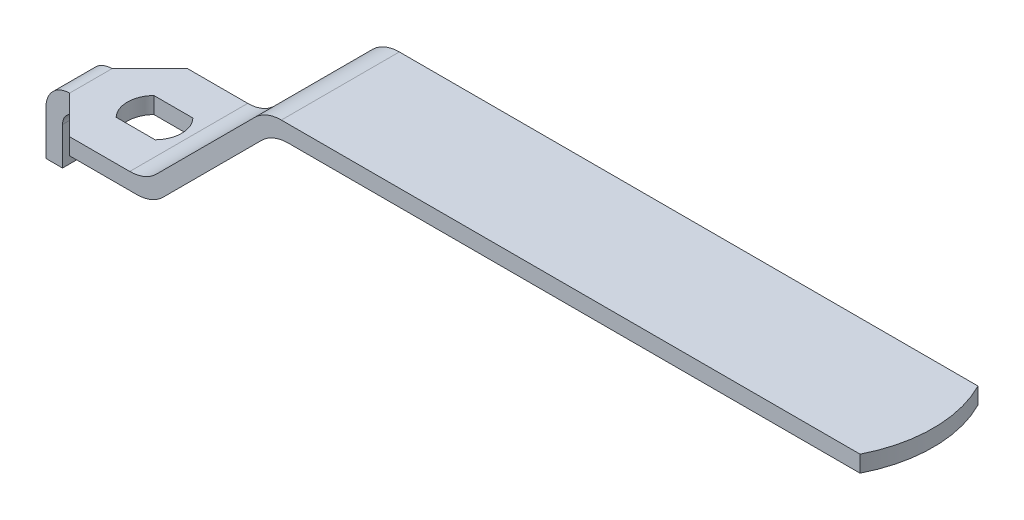
ISO-10303-21;
HEADER;
FILE_DESCRIPTION(('STEP AP214'),'2;1');
FILE_NAME('part.step','',(''),(''),'','','');
FILE_SCHEMA(('AUTOMOTIVE_DESIGN { 1 0 10303 214 1 1 1 1 }'));
ENDSEC;
DATA;
#1=APPLICATION_CONTEXT('core data for automotive mechanical design processes');
#2=APPLICATION_PROTOCOL_DEFINITION('international standard','automotive_design',2000,#1);
#3=PRODUCT_CONTEXT('',#1,'mechanical');
#4=PRODUCT('Part','Part','',(#3));
#5=PRODUCT_RELATED_PRODUCT_CATEGORY('part','',(#4));
#6=PRODUCT_DEFINITION_FORMATION('','',#4);
#7=PRODUCT_DEFINITION_CONTEXT('part definition',#1,'design');
#8=PRODUCT_DEFINITION('design','',#6,#7);
#9=PRODUCT_DEFINITION_SHAPE('','',#8);
#10=(LENGTH_UNIT() NAMED_UNIT(*) SI_UNIT(.MILLI.,.METRE.));
#11=(NAMED_UNIT(*) PLANE_ANGLE_UNIT() SI_UNIT($,.RADIAN.));
#12=(NAMED_UNIT(*) SI_UNIT($,.STERADIAN.) SOLID_ANGLE_UNIT());
#13=UNCERTAINTY_MEASURE_WITH_UNIT(LENGTH_MEASURE(1.E-05),#10,'distance_accuracy_value','');
#14=(GEOMETRIC_REPRESENTATION_CONTEXT(3) GLOBAL_UNCERTAINTY_ASSIGNED_CONTEXT((#13)) GLOBAL_UNIT_ASSIGNED_CONTEXT((#10,
#11,#12)) REPRESENTATION_CONTEXT('',''));
#15=CARTESIAN_POINT('',(0.,0.,0.));
#16=DIRECTION('',(0.,0.,1.));
#17=DIRECTION('',(1.,0.,0.));
#18=AXIS2_PLACEMENT_3D('',#15,#16,#17);
#19=CARTESIAN_POINT('',(-18.5,-14.5,12.5));
#20=DIRECTION('',(0.,1.,0.));
#21=DIRECTION('',(0.,0.,1.));
#22=AXIS2_PLACEMENT_3D('',#19,#20,#21);
#23=PLANE('',#22);
#24=DIRECTION('',(-1.,0.,0.));
#25=VECTOR('',#24,1.);
#26=CARTESIAN_POINT('',(-13.5,-14.5,4.5));
#27=LINE('',#26,#25);
#28=CARTESIAN_POINT('',(-15.,-14.5,4.5));
#29=VERTEX_POINT('',#28);
#30=CARTESIAN_POINT('',(-18.5,-14.5,4.5));
#31=VERTEX_POINT('',#30);
#32=EDGE_CURVE('E222',#29,#31,#27,.T.);
#33=ORIENTED_EDGE('',*,*,#32,.T.);
#34=DIRECTION('',(0.,0.,-1.));
#35=VECTOR('',#34,1.);
#36=CARTESIAN_POINT('',(-18.5,-14.5,12.5));
#37=LINE('',#36,#35);
#38=CARTESIAN_POINT('',(-18.5,-14.5,-4.5));
#39=VERTEX_POINT('',#38);
#40=EDGE_CURVE('E217',#31,#39,#37,.T.);
#41=ORIENTED_EDGE('',*,*,#40,.T.);
#42=DIRECTION('',(1.,0.,0.));
#43=VECTOR('',#42,1.);
#44=CARTESIAN_POINT('',(-13.5,-14.5,-4.5));
#45=LINE('',#44,#43);
#46=CARTESIAN_POINT('',(-15.,-14.5,-4.5));
#47=VERTEX_POINT('',#46);
#48=EDGE_CURVE('E205',#39,#47,#45,.T.);
#49=ORIENTED_EDGE('',*,*,#48,.T.);
#50=DIRECTION('',(0.,0.,1.));
#51=VECTOR('',#50,1.);
#52=CARTESIAN_POINT('',(-15.,-14.5,12.5));
#53=LINE('',#52,#51);
#54=EDGE_CURVE('E209',#47,#29,#53,.T.);
#55=ORIENTED_EDGE('',*,*,#54,.T.);
#56=EDGE_LOOP('',(#33,#41,#49,#55));
#57=FACE_BOUND('',#56,.T.);
#58=ADVANCED_FACE('F17',(#57),#23,.F.);
#59=CARTESIAN_POINT('',(-18.5,-14.5,12.5));
#60=DIRECTION('',(1.,0.,0.));
#61=DIRECTION('',(0.,0.,-1.));
#62=AXIS2_PLACEMENT_3D('',#59,#60,#61);
#63=PLANE('',#62);
#64=DIRECTION('',(0.,1.,0.));
#65=VECTOR('',#64,1.);
#66=CARTESIAN_POINT('',(-18.5,-50.,4.5));
#67=LINE('',#66,#65);
#68=CARTESIAN_POINT('',(-18.5,-5.,4.5));
#69=VERTEX_POINT('',#68);
#70=EDGE_CURVE('E225',#31,#69,#67,.T.);
#71=ORIENTED_EDGE('',*,*,#70,.T.);
#72=DIRECTION('',(0.,0.,1.));
#73=VECTOR('',#72,1.);
#74=CARTESIAN_POINT('',(-18.5,-5.,12.5));
#75=LINE('',#74,#73);
#76=CARTESIAN_POINT('',(-18.5,-5.,-4.5));
#77=VERTEX_POINT('',#76);
#78=EDGE_CURVE('E187',#77,#69,#75,.T.);
#79=ORIENTED_EDGE('',*,*,#78,.F.);
#80=DIRECTION('',(0.,1.,0.));
#81=VECTOR('',#80,1.);
#82=CARTESIAN_POINT('',(-18.5,-50.,-4.5));
#83=LINE('',#82,#81);
#84=EDGE_CURVE('E183',#77,#39,#83,.F.);
#85=ORIENTED_EDGE('',*,*,#84,.T.);
#86=ORIENTED_EDGE('',*,*,#40,.F.);
#87=EDGE_LOOP('',(#71,#79,#85,#86));
#88=FACE_BOUND('',#87,.T.);
#89=ADVANCED_FACE('F440',(#88),#63,.F.);
#90=CARTESIAN_POINT('',(-15.,-14.5,12.5));
#91=DIRECTION('',(-1.,0.,0.));
#92=DIRECTION('',(0.,0.,1.));
#93=AXIS2_PLACEMENT_3D('',#90,#91,#92);
#94=PLANE('',#93);
#95=DIRECTION('',(0.,1.,0.));
#96=VECTOR('',#95,1.);
#97=CARTESIAN_POINT('',(-15.,-50.,4.5));
#98=LINE('',#97,#96);
#99=CARTESIAN_POINT('',(-15.,-6.5,4.5));
#100=VERTEX_POINT('',#99);
#101=EDGE_CURVE('E226',#100,#29,#98,.F.);
#102=ORIENTED_EDGE('',*,*,#101,.T.);
#103=ORIENTED_EDGE('',*,*,#54,.F.);
#104=DIRECTION('',(0.,1.,0.));
#105=VECTOR('',#104,1.);
#106=CARTESIAN_POINT('',(-15.,-50.,-4.5));
#107=LINE('',#106,#105);
#108=CARTESIAN_POINT('',(-15.,-6.5,-4.5));
#109=VERTEX_POINT('',#108);
#110=EDGE_CURVE('E203',#47,#109,#107,.T.);
#111=ORIENTED_EDGE('',*,*,#110,.T.);
#112=DIRECTION('',(0.,0.,1.));
#113=VECTOR('',#112,1.);
#114=CARTESIAN_POINT('',(-15.,-6.5,12.5));
#115=LINE('',#114,#113);
#116=EDGE_CURVE('E212',#109,#100,#115,.T.);
#117=ORIENTED_EDGE('',*,*,#116,.T.);
#118=EDGE_LOOP('',(#102,#103,#111,#117));
#119=FACE_BOUND('',#118,.T.);
#120=ADVANCED_FACE('F446',(#119),#94,.F.);
#121=CARTESIAN_POINT('',(-13.5,-50.,-4.5));
#122=DIRECTION('',(0.,0.,1.));
#123=DIRECTION('',(1.,0.,0.));
#124=AXIS2_PLACEMENT_3D('',#121,#122,#123);
#125=PLANE('',#124);
#126=CARTESIAN_POINT('',(-12.,-6.5,-4.5));
#127=DIRECTION('',(0.,0.,1.));
#128=DIRECTION('',(1.,0.,0.));
#129=AXIS2_PLACEMENT_3D('',#126,#127,#128);
#130=CIRCLE('',#129,3.);
#131=CARTESIAN_POINT('',(-13.5,-3.9019237886467,-4.50000000000001));
#132=VERTEX_POINT('',#131);
#133=EDGE_CURVE('E216',#132,#109,#130,.T.);
#134=ORIENTED_EDGE('',*,*,#133,.T.);
#135=ORIENTED_EDGE('',*,*,#110,.F.);
#136=ORIENTED_EDGE('',*,*,#48,.F.);
#137=ORIENTED_EDGE('',*,*,#84,.F.);
#138=CARTESIAN_POINT('',(-13.5,-5.,-4.5));
#139=DIRECTION('',(0.,0.,1.));
#140=DIRECTION('',(1.,0.,0.));
#141=AXIS2_PLACEMENT_3D('',#138,#139,#140);
#142=CIRCLE('',#141,5.);
#143=CARTESIAN_POINT('',(-13.5,0.,-4.50000000000001));
#144=VERTEX_POINT('',#143);
#145=EDGE_CURVE('E20',#144,#77,#142,.T.);
#146=ORIENTED_EDGE('',*,*,#145,.F.);
#147=DIRECTION('',(0.,1.,0.));
#148=VECTOR('',#147,1.);
#149=CARTESIAN_POINT('',(-13.5,-50.,-4.50000000000002));
#150=LINE('',#149,#148);
#151=EDGE_CURVE('E153',#144,#132,#150,.F.);
#152=ORIENTED_EDGE('',*,*,#151,.T.);
#153=EDGE_LOOP('',(#134,#135,#136,#137,#146,#152));
#154=FACE_BOUND('',#153,.T.);
#155=ADVANCED_FACE('F180',(#154),#125,.F.);
#156=CARTESIAN_POINT('',(-13.5,-5.,12.5));
#157=DIRECTION('',(0.,0.,1.));
#158=DIRECTION('',(1.,0.,0.));
#159=AXIS2_PLACEMENT_3D('',#156,#157,#158);
#160=CYLINDRICAL_SURFACE('',#159,5.);
#161=DIRECTION('',(0.,0.,1.));
#162=VECTOR('',#161,1.);
#163=CARTESIAN_POINT('',(-13.5,0.,12.5));
#164=LINE('',#163,#162);
#165=CARTESIAN_POINT('',(-13.5,0.,4.50000000000002));
#166=VERTEX_POINT('',#165);
#167=EDGE_CURVE('E171',#166,#144,#164,.F.);
#168=ORIENTED_EDGE('',*,*,#167,.T.);
#169=ORIENTED_EDGE('',*,*,#145,.T.);
#170=ORIENTED_EDGE('',*,*,#78,.T.);
#171=CARTESIAN_POINT('',(-13.5,-5.,4.5));
#172=DIRECTION('',(0.,0.,1.));
#173=DIRECTION('',(1.,0.,0.));
#174=AXIS2_PLACEMENT_3D('',#171,#172,#173);
#175=CIRCLE('',#174,5.);
#176=EDGE_CURVE('E186',#69,#166,#175,.F.);
#177=ORIENTED_EDGE('',*,*,#176,.T.);
#178=EDGE_LOOP('',(#168,#169,#170,#177));
#179=FACE_BOUND('',#178,.T.);
#180=ADVANCED_FACE('F189',(#179),#160,.T.);
#181=CARTESIAN_POINT('',(-13.5,-50.,4.5));
#182=DIRECTION('',(0.,0.,-1.));
#183=DIRECTION('',(-1.,0.,0.));
#184=AXIS2_PLACEMENT_3D('',#181,#182,#183);
#185=PLANE('',#184);
#186=ORIENTED_EDGE('',*,*,#32,.F.);
#187=ORIENTED_EDGE('',*,*,#101,.F.);
#188=CARTESIAN_POINT('',(-12.,-6.5,4.5));
#189=DIRECTION('',(0.,0.,1.));
#190=DIRECTION('',(1.,0.,0.));
#191=AXIS2_PLACEMENT_3D('',#188,#189,#190);
#192=CIRCLE('',#191,3.);
#193=CARTESIAN_POINT('',(-13.5,-3.9019237886467,4.50000000000001));
#194=VERTEX_POINT('',#193);
#195=EDGE_CURVE('E215',#100,#194,#192,.F.);
#196=ORIENTED_EDGE('',*,*,#195,.T.);
#197=DIRECTION('',(0.,1.,0.));
#198=VECTOR('',#197,1.);
#199=CARTESIAN_POINT('',(-13.5,-50.,4.50000000000002));
#200=LINE('',#199,#198);
#201=EDGE_CURVE('E288',#194,#166,#200,.T.);
#202=ORIENTED_EDGE('',*,*,#201,.T.);
#203=ORIENTED_EDGE('',*,*,#176,.F.);
#204=ORIENTED_EDGE('',*,*,#70,.F.);
#205=EDGE_LOOP('',(#186,#187,#196,#202,#203,#204));
#206=FACE_BOUND('',#205,.T.);
#207=ADVANCED_FACE('F444',(#206),#185,.F.);
#208=CARTESIAN_POINT('',(-12.,-6.5,12.5));
#209=DIRECTION('',(0.,0.,1.));
#210=DIRECTION('',(1.,0.,0.));
#211=AXIS2_PLACEMENT_3D('',#208,#209,#210);
#212=CYLINDRICAL_SURFACE('',#211,3.);
#213=ORIENTED_EDGE('',*,*,#195,.F.);
#214=ORIENTED_EDGE('',*,*,#116,.F.);
#215=ORIENTED_EDGE('',*,*,#133,.F.);
#216=CARTESIAN_POINT('',(-12.,-6.5,-6.00000000000004));
#217=DIRECTION('',(0.707106781186547,0.,0.707106781186548));
#218=DIRECTION('',(-0.707106781186548,0.,0.707106781186547));
#219=AXIS2_PLACEMENT_3D('',#216,#217,#218);
#220=ELLIPSE('',#219,4.24264068711928,3.);
#221=CARTESIAN_POINT('',(-12.,-3.5,-6.00000000000002));
#222=VERTEX_POINT('',#221);
#223=EDGE_CURVE('E160',#132,#222,#220,.F.);
#224=ORIENTED_EDGE('',*,*,#223,.T.);
#225=DIRECTION('',(0.,0.,1.));
#226=VECTOR('',#225,1.);
#227=CARTESIAN_POINT('',(-12.,-3.5,12.5));
#228=LINE('',#227,#226);
#229=CARTESIAN_POINT('',(-12.,-3.5,6.00000000000002));
#230=VERTEX_POINT('',#229);
#231=EDGE_CURVE('E305',#222,#230,#228,.T.);
#232=ORIENTED_EDGE('',*,*,#231,.T.);
#233=CARTESIAN_POINT('',(-12.,-6.5,6.00000000000004));
#234=DIRECTION('',(0.707106781186547,0.,-0.707106781186548));
#235=DIRECTION('',(0.707106781186548,0.,0.707106781186547));
#236=AXIS2_PLACEMENT_3D('',#233,#234,#235);
#237=ELLIPSE('',#236,4.24264068711928,3.);
#238=EDGE_CURVE('E285',#230,#194,#237,.F.);
#239=ORIENTED_EDGE('',*,*,#238,.T.);
#240=EDGE_LOOP('',(#213,#214,#215,#224,#232,#239));
#241=FACE_BOUND('',#240,.T.);
#242=ADVANCED_FACE('F450',(#241),#212,.F.);
#243=CARTESIAN_POINT('',(0.,-50.,0.));
#244=DIRECTION('',(0.,-1.,0.));
#245=DIRECTION('',(0.,0.,-1.));
#246=AXIS2_PLACEMENT_3D('',#243,#244,#245);
#247=CYLINDRICAL_SURFACE('',#246,5.75);
#248=CARTESIAN_POINT('',(0.,-3.5,0.));
#249=DIRECTION('',(0.,-1.,0.));
#250=DIRECTION('',(0.,0.,-1.));
#251=AXIS2_PLACEMENT_3D('',#248,#249,#250);
#252=CIRCLE('',#251,5.75);
#253=CARTESIAN_POINT('',(-4.13067791046457,-3.5,4.));
#254=VERTEX_POINT('',#253);
#255=CARTESIAN_POINT('',(-4.13067791046457,-3.5,-4.));
#256=VERTEX_POINT('',#255);
#257=EDGE_CURVE('E281',#254,#256,#252,.T.);
#258=ORIENTED_EDGE('',*,*,#257,.T.);
#259=DIRECTION('',(0.,1.,0.));
#260=VECTOR('',#259,1.);
#261=CARTESIAN_POINT('',(-4.13067791046457,-50.,-4.));
#262=LINE('',#261,#260);
#263=CARTESIAN_POINT('',(-4.13067791046457,0.,-4.));
#264=VERTEX_POINT('',#263);
#265=EDGE_CURVE('E296',#256,#264,#262,.T.);
#266=ORIENTED_EDGE('',*,*,#265,.T.);
#267=CARTESIAN_POINT('',(0.,0.,0.));
#268=DIRECTION('',(0.,-1.,0.));
#269=DIRECTION('',(0.,0.,-1.));
#270=AXIS2_PLACEMENT_3D('',#267,#268,#269);
#271=CIRCLE('',#270,5.75);
#272=CARTESIAN_POINT('',(-4.13067791046457,0.,4.));
#273=VERTEX_POINT('',#272);
#274=EDGE_CURVE('E192',#264,#273,#271,.F.);
#275=ORIENTED_EDGE('',*,*,#274,.T.);
#276=DIRECTION('',(0.,1.,0.));
#277=VECTOR('',#276,1.);
#278=CARTESIAN_POINT('',(-4.13067791046457,-50.,4.));
#279=LINE('',#278,#277);
#280=EDGE_CURVE('E313',#273,#254,#279,.F.);
#281=ORIENTED_EDGE('',*,*,#280,.T.);
#282=EDGE_LOOP('',(#258,#266,#275,#281));
#283=FACE_BOUND('',#282,.T.);
#284=ADVANCED_FACE('F509',(#283),#247,.F.);
#285=CARTESIAN_POINT('',(-4.13067791046457,-50.,-4.));
#286=DIRECTION('',(0.,0.,-1.));
#287=DIRECTION('',(-1.,0.,0.));
#288=AXIS2_PLACEMENT_3D('',#285,#286,#287);
#289=PLANE('',#288);
#290=DIRECTION('',(1.,0.,0.));
#291=VECTOR('',#290,1.);
#292=CARTESIAN_POINT('',(-12.,-3.5,-4.));
#293=LINE('',#292,#291);
#294=CARTESIAN_POINT('',(4.13067791046457,-3.5,-4.));
#295=VERTEX_POINT('',#294);
#296=EDGE_CURVE('E280',#256,#295,#293,.T.);
#297=ORIENTED_EDGE('',*,*,#296,.T.);
#298=DIRECTION('',(0.,-1.,0.));
#299=VECTOR('',#298,1.);
#300=CARTESIAN_POINT('',(4.13067791046457,-50.,-4.));
#301=LINE('',#300,#299);
#302=CARTESIAN_POINT('',(4.13067791046457,0.,-4.));
#303=VERTEX_POINT('',#302);
#304=EDGE_CURVE('E311',#295,#303,#301,.F.);
#305=ORIENTED_EDGE('',*,*,#304,.T.);
#306=DIRECTION('',(1.,0.,0.));
#307=VECTOR('',#306,1.);
#308=CARTESIAN_POINT('',(-13.5,0.,-4.));
#309=LINE('',#308,#307);
#310=EDGE_CURVE('E292',#303,#264,#309,.F.);
#311=ORIENTED_EDGE('',*,*,#310,.T.);
#312=ORIENTED_EDGE('',*,*,#265,.F.);
#313=EDGE_LOOP('',(#297,#305,#311,#312));
#314=FACE_BOUND('',#313,.T.);
#315=ADVANCED_FACE('F512',(#314),#289,.F.);
#316=CARTESIAN_POINT('',(0.,-50.,0.));
#317=DIRECTION('',(0.,-1.,0.));
#318=DIRECTION('',(0.,0.,-1.));
#319=AXIS2_PLACEMENT_3D('',#316,#317,#318);
#320=CYLINDRICAL_SURFACE('',#319,5.75);
#321=CARTESIAN_POINT('',(0.,-3.5,0.));
#322=DIRECTION('',(0.,-1.,0.));
#323=DIRECTION('',(0.,0.,-1.));
#324=AXIS2_PLACEMENT_3D('',#321,#322,#323);
#325=CIRCLE('',#324,5.75);
#326=CARTESIAN_POINT('',(4.13067791046457,-3.5,4.));
#327=VERTEX_POINT('',#326);
#328=EDGE_CURVE('E276',#295,#327,#325,.T.);
#329=ORIENTED_EDGE('',*,*,#328,.T.);
#330=DIRECTION('',(0.,1.,0.));
#331=VECTOR('',#330,1.);
#332=CARTESIAN_POINT('',(4.13067791046457,-50.,4.));
#333=LINE('',#332,#331);
#334=CARTESIAN_POINT('',(4.13067791046457,0.,4.));
#335=VERTEX_POINT('',#334);
#336=EDGE_CURVE('E164',#327,#335,#333,.T.);
#337=ORIENTED_EDGE('',*,*,#336,.T.);
#338=CARTESIAN_POINT('',(0.,0.,0.));
#339=DIRECTION('',(0.,-1.,0.));
#340=DIRECTION('',(0.,0.,-1.));
#341=AXIS2_PLACEMENT_3D('',#338,#339,#340);
#342=CIRCLE('',#341,5.75);
#343=EDGE_CURVE('E290',#335,#303,#342,.F.);
#344=ORIENTED_EDGE('',*,*,#343,.T.);
#345=ORIENTED_EDGE('',*,*,#304,.F.);
#346=EDGE_LOOP('',(#329,#337,#344,#345));
#347=FACE_BOUND('',#346,.T.);
#348=ADVANCED_FACE('F514',(#347),#320,.F.);
#349=CARTESIAN_POINT('',(-4.13067791046457,-50.,4.));
#350=DIRECTION('',(0.,0.,1.));
#351=DIRECTION('',(1.,0.,0.));
#352=AXIS2_PLACEMENT_3D('',#349,#350,#351);
#353=PLANE('',#352);
#354=DIRECTION('',(1.,0.,0.));
#355=VECTOR('',#354,1.);
#356=CARTESIAN_POINT('',(-12.,-3.5,4.));
#357=LINE('',#356,#355);
#358=EDGE_CURVE('E279',#327,#254,#357,.F.);
#359=ORIENTED_EDGE('',*,*,#358,.T.);
#360=ORIENTED_EDGE('',*,*,#280,.F.);
#361=DIRECTION('',(1.,0.,0.));
#362=VECTOR('',#361,1.);
#363=CARTESIAN_POINT('',(-13.5,0.,4.));
#364=LINE('',#363,#362);
#365=EDGE_CURVE('E195',#273,#335,#364,.T.);
#366=ORIENTED_EDGE('',*,*,#365,.T.);
#367=ORIENTED_EDGE('',*,*,#336,.F.);
#368=EDGE_LOOP('',(#359,#360,#366,#367));
#369=FACE_BOUND('',#368,.T.);
#370=ADVANCED_FACE('F470',(#369),#353,.F.);
#371=CARTESIAN_POINT('',(-0.674227594139518,-50.,-17.3257724058605));
#372=DIRECTION('',(0.707106781186547,0.,0.707106781186548));
#373=DIRECTION('',(0.707106781186548,0.,-0.707106781186547));
#374=AXIS2_PLACEMENT_3D('',#371,#372,#373);
#375=PLANE('',#374);
#376=DIRECTION('',(-0.707106781186548,0.,0.707106781186547));
#377=VECTOR('',#376,1.);
#378=CARTESIAN_POINT('',(-5.5,-3.5,-12.5));
#379=LINE('',#378,#377);
#380=CARTESIAN_POINT('',(-5.5,-3.5,-12.5));
#381=VERTEX_POINT('',#380);
#382=EDGE_CURVE('E308',#381,#222,#379,.T.);
#383=ORIENTED_EDGE('',*,*,#382,.T.);
#384=ORIENTED_EDGE('',*,*,#223,.F.);
#385=ORIENTED_EDGE('',*,*,#151,.F.);
#386=DIRECTION('',(0.707106781186548,0.,-0.707106781186548));
#387=VECTOR('',#386,1.);
#388=CARTESIAN_POINT('',(-13.5,0.,-4.5));
#389=LINE('',#388,#387);
#390=CARTESIAN_POINT('',(-5.5,0.,-12.5));
#391=VERTEX_POINT('',#390);
#392=EDGE_CURVE('E158',#144,#391,#389,.T.);
#393=ORIENTED_EDGE('',*,*,#392,.T.);
#394=DIRECTION('',(0.,1.,0.));
#395=VECTOR('',#394,1.);
#396=CARTESIAN_POINT('',(-5.5,14.,-12.5));
#397=LINE('',#396,#395);
#398=EDGE_CURVE('E321',#391,#381,#397,.F.);
#399=ORIENTED_EDGE('',*,*,#398,.T.);
#400=EDGE_LOOP('',(#383,#384,#385,#393,#399));
#401=FACE_BOUND('',#400,.T.);
#402=ADVANCED_FACE('F156',(#401),#375,.F.);
#403=CARTESIAN_POINT('',(12.9053235769987,2.34314575050759,12.5));
#404=DIRECTION('',(0.707106781186548,-0.707106781186548,0.));
#405=DIRECTION('',(0.707106781186548,0.707106781186548,0.));
#406=AXIS2_PLACEMENT_3D('',#403,#404,#405);
#407=PLANE('',#406);
#408=DIRECTION('',(0.,0.,1.));
#409=VECTOR('',#408,1.);
#410=CARTESIAN_POINT('',(12.9053235769987,2.3431457505076,12.5));
#411=LINE('',#410,#409);
#412=CARTESIAN_POINT('',(12.9053235769987,2.3431457505076,-12.5));
#413=VERTEX_POINT('',#412);
#414=CARTESIAN_POINT('',(12.9053235769987,2.3431457505076,12.5));
#415=VERTEX_POINT('',#414);
#416=EDGE_CURVE('E176',#413,#415,#411,.T.);
#417=ORIENTED_EDGE('',*,*,#416,.T.);
#418=DIRECTION('',(-0.707106781186547,-0.707106781186548,0.));
#419=VECTOR('',#418,1.);
#420=CARTESIAN_POINT('',(33.7190320759835,23.1568542494924,12.5));
#421=LINE('',#420,#419);
#422=CARTESIAN_POINT('',(33.7190320759836,23.1568542494924,12.5));
#423=VERTEX_POINT('',#422);
#424=EDGE_CURVE('E251',#423,#415,#421,.T.);
#425=ORIENTED_EDGE('',*,*,#424,.F.);
#426=DIRECTION('',(0.,0.,1.));
#427=VECTOR('',#426,1.);
#428=CARTESIAN_POINT('',(33.7190320759836,23.1568542494923,12.5));
#429=LINE('',#428,#427);
#430=CARTESIAN_POINT('',(33.7190320759836,23.1568542494924,-12.5));
#431=VERTEX_POINT('',#430);
#432=EDGE_CURVE('E275',#431,#423,#429,.T.);
#433=ORIENTED_EDGE('',*,*,#432,.F.);
#434=DIRECTION('',(-0.707106781186547,-0.707106781186548,0.));
#435=VECTOR('',#434,1.);
#436=CARTESIAN_POINT('',(33.7190320759835,23.1568542494924,-12.5));
#437=LINE('',#436,#435);
#438=EDGE_CURVE('E271',#431,#413,#437,.T.);
#439=ORIENTED_EDGE('',*,*,#438,.T.);
#440=EDGE_LOOP('',(#417,#425,#433,#439));
#441=FACE_BOUND('',#440,.T.);
#442=ADVANCED_FACE('F461',(#441),#407,.F.);
#443=CARTESIAN_POINT('',(7.24846932750633,8.,12.5));
#444=DIRECTION('',(0.,0.,1.));
#445=DIRECTION('',(1.,0.,0.));
#446=AXIS2_PLACEMENT_3D('',#443,#444,#445);
#447=CYLINDRICAL_SURFACE('',#446,8.);
#448=DIRECTION('',(0.,0.,1.));
#449=VECTOR('',#448,1.);
#450=CARTESIAN_POINT('',(7.24846932750633,0.,12.5));
#451=LINE('',#450,#449);
#452=CARTESIAN_POINT('',(7.24846932750633,0.,-12.5));
#453=VERTEX_POINT('',#452);
#454=CARTESIAN_POINT('',(7.24846932750633,0.,12.5));
#455=VERTEX_POINT('',#454);
#456=EDGE_CURVE('E175',#453,#455,#451,.T.);
#457=ORIENTED_EDGE('',*,*,#456,.T.);
#458=CARTESIAN_POINT('',(7.24846932750633,8.,12.5));
#459=DIRECTION('',(0.,0.,1.));
#460=DIRECTION('',(1.,0.,0.));
#461=AXIS2_PLACEMENT_3D('',#458,#459,#460);
#462=CIRCLE('',#461,8.);
#463=EDGE_CURVE('E248',#415,#455,#462,.F.);
#464=ORIENTED_EDGE('',*,*,#463,.F.);
#465=ORIENTED_EDGE('',*,*,#416,.F.);
#466=CARTESIAN_POINT('',(7.24846932750633,8.,-12.5));
#467=DIRECTION('',(0.,0.,1.));
#468=DIRECTION('',(1.,0.,0.));
#469=AXIS2_PLACEMENT_3D('',#466,#467,#468);
#470=CIRCLE('',#469,8.);
#471=EDGE_CURVE('E268',#413,#453,#470,.F.);
#472=ORIENTED_EDGE('',*,*,#471,.T.);
#473=EDGE_LOOP('',(#457,#464,#465,#472));
#474=FACE_BOUND('',#473,.T.);
#475=ADVANCED_FACE('F459',(#474),#447,.F.);
#476=CARTESIAN_POINT('',(-13.5,0.,12.5));
#477=DIRECTION('',(0.,-1.,0.));
#478=DIRECTION('',(1.,0.,0.));
#479=AXIS2_PLACEMENT_3D('',#476,#477,#478);
#480=PLANE('',#479);
#481=ORIENTED_EDGE('',*,*,#343,.F.);
#482=ORIENTED_EDGE('',*,*,#365,.F.);
#483=ORIENTED_EDGE('',*,*,#274,.F.);
#484=ORIENTED_EDGE('',*,*,#310,.F.);
#485=EDGE_LOOP('',(#481,#482,#483,#484));
#486=FACE_BOUND('',#485,.T.);
#487=DIRECTION('',(-0.707106781186548,0.,-0.707106781186547));
#488=VECTOR('',#487,1.);
#489=CARTESIAN_POINT('',(-0.674227594139518,0.,17.3257724058605));
#490=LINE('',#489,#488);
#491=CARTESIAN_POINT('',(-5.5,0.,12.5));
#492=VERTEX_POINT('',#491);
#493=EDGE_CURVE('E289',#166,#492,#490,.F.);
#494=ORIENTED_EDGE('',*,*,#493,.T.);
#495=DIRECTION('',(1.,0.,0.));
#496=VECTOR('',#495,1.);
#497=CARTESIAN_POINT('',(40.8256337937818,0.,12.5));
#498=LINE('',#497,#496);
#499=EDGE_CURVE('E250',#455,#492,#498,.F.);
#500=ORIENTED_EDGE('',*,*,#499,.F.);
#501=ORIENTED_EDGE('',*,*,#456,.F.);
#502=DIRECTION('',(1.,0.,0.));
#503=VECTOR('',#502,1.);
#504=CARTESIAN_POINT('',(40.8256337937818,0.,-12.5));
#505=LINE('',#504,#503);
#506=EDGE_CURVE('E174',#453,#391,#505,.F.);
#507=ORIENTED_EDGE('',*,*,#506,.T.);
#508=ORIENTED_EDGE('',*,*,#392,.F.);
#509=ORIENTED_EDGE('',*,*,#167,.F.);
#510=EDGE_LOOP('',(#494,#500,#501,#507,#508,#509));
#511=FACE_BOUND('',#510,.T.);
#512=ADVANCED_FACE('F169',(#486,#511),#480,.F.);
#513=CARTESIAN_POINT('',(-0.674227594139518,-50.,17.3257724058605));
#514=DIRECTION('',(0.707106781186547,0.,-0.707106781186548));
#515=DIRECTION('',(-0.707106781186548,0.,-0.707106781186547));
#516=AXIS2_PLACEMENT_3D('',#513,#514,#515);
#517=PLANE('',#516);
#518=ORIENTED_EDGE('',*,*,#238,.F.);
#519=DIRECTION('',(0.707106781186548,0.,0.707106781186548));
#520=VECTOR('',#519,1.);
#521=CARTESIAN_POINT('',(-12.,-3.5,6.));
#522=LINE('',#521,#520);
#523=CARTESIAN_POINT('',(-5.5,-3.5,12.5));
#524=VERTEX_POINT('',#523);
#525=EDGE_CURVE('E284',#230,#524,#522,.T.);
#526=ORIENTED_EDGE('',*,*,#525,.T.);
#527=DIRECTION('',(0.,1.,0.));
#528=VECTOR('',#527,1.);
#529=CARTESIAN_POINT('',(-5.5,14.,12.5));
#530=LINE('',#529,#528);
#531=EDGE_CURVE('E340',#492,#524,#530,.F.);
#532=ORIENTED_EDGE('',*,*,#531,.F.);
#533=ORIENTED_EDGE('',*,*,#493,.F.);
#534=ORIENTED_EDGE('',*,*,#201,.F.);
#535=EDGE_LOOP('',(#518,#526,#532,#533,#534));
#536=FACE_BOUND('',#535,.T.);
#537=ADVANCED_FACE('F453',(#536),#517,.F.);
#538=CARTESIAN_POINT('',(-12.,-3.5,12.5));
#539=DIRECTION('',(0.,1.,0.));
#540=DIRECTION('',(0.,0.,1.));
#541=AXIS2_PLACEMENT_3D('',#538,#539,#540);
#542=PLANE('',#541);
#543=ORIENTED_EDGE('',*,*,#328,.F.);
#544=ORIENTED_EDGE('',*,*,#296,.F.);
#545=ORIENTED_EDGE('',*,*,#257,.F.);
#546=ORIENTED_EDGE('',*,*,#358,.F.);
#547=EDGE_LOOP('',(#543,#544,#545,#546));
#548=FACE_BOUND('',#547,.T.);
#549=ORIENTED_EDGE('',*,*,#525,.F.);
#550=ORIENTED_EDGE('',*,*,#231,.F.);
#551=ORIENTED_EDGE('',*,*,#382,.F.);
#552=DIRECTION('',(1.,0.,0.));
#553=VECTOR('',#552,1.);
#554=CARTESIAN_POINT('',(40.8256337937818,-3.5,-12.5));
#555=LINE('',#554,#553);
#556=CARTESIAN_POINT('',(8.6982167958122,-3.5,-12.5));
#557=VERTEX_POINT('',#556);
#558=EDGE_CURVE('E267',#381,#557,#555,.T.);
#559=ORIENTED_EDGE('',*,*,#558,.T.);
#560=DIRECTION('',(0.,0.,1.));
#561=VECTOR('',#560,1.);
#562=CARTESIAN_POINT('',(8.6982167958122,-3.5,12.5));
#563=LINE('',#562,#561);
#564=CARTESIAN_POINT('',(8.6982167958122,-3.5,12.5));
#565=VERTEX_POINT('',#564);
#566=EDGE_CURVE('E351',#565,#557,#563,.F.);
#567=ORIENTED_EDGE('',*,*,#566,.F.);
#568=DIRECTION('',(1.,0.,0.));
#569=VECTOR('',#568,1.);
#570=CARTESIAN_POINT('',(40.8256337937818,-3.5,12.5));
#571=LINE('',#570,#569);
#572=EDGE_CURVE('E247',#524,#565,#571,.T.);
#573=ORIENTED_EDGE('',*,*,#572,.F.);
#574=EDGE_LOOP('',(#549,#550,#551,#559,#567,#573));
#575=FACE_BOUND('',#574,.T.);
#576=ADVANCED_FACE('F425',(#548,#575),#542,.F.);
#577=CARTESIAN_POINT('',(8.6982167958122,4.5,12.5));
#578=DIRECTION('',(0.,0.,1.));
#579=DIRECTION('',(1.,0.,0.));
#580=AXIS2_PLACEMENT_3D('',#577,#578,#579);
#581=CYLINDRICAL_SURFACE('',#580,8.);
#582=CARTESIAN_POINT('',(8.6982167958122,4.5,12.5));
#583=DIRECTION('',(0.,0.,1.));
#584=DIRECTION('',(1.,0.,0.));
#585=AXIS2_PLACEMENT_3D('',#582,#583,#584);
#586=CIRCLE('',#585,8.);
#587=CARTESIAN_POINT('',(14.3550710453046,-1.15685424949239,12.5));
#588=VERTEX_POINT('',#587);
#589=EDGE_CURVE('E245',#565,#588,#586,.T.);
#590=ORIENTED_EDGE('',*,*,#589,.F.);
#591=ORIENTED_EDGE('',*,*,#566,.T.);
#592=CARTESIAN_POINT('',(8.6982167958122,4.5,-12.5));
#593=DIRECTION('',(0.,0.,1.));
#594=DIRECTION('',(1.,0.,0.));
#595=AXIS2_PLACEMENT_3D('',#592,#593,#594);
#596=CIRCLE('',#595,8.);
#597=CARTESIAN_POINT('',(14.3550710453046,-1.15685424949239,-12.5));
#598=VERTEX_POINT('',#597);
#599=EDGE_CURVE('E264',#557,#598,#596,.T.);
#600=ORIENTED_EDGE('',*,*,#599,.T.);
#601=DIRECTION('',(0.,0.,1.));
#602=VECTOR('',#601,1.);
#603=CARTESIAN_POINT('',(14.3550710453046,-1.15685424949238,12.5));
#604=LINE('',#603,#602);
#605=EDGE_CURVE('E353',#598,#588,#604,.T.);
#606=ORIENTED_EDGE('',*,*,#605,.T.);
#607=EDGE_LOOP('',(#590,#591,#600,#606));
#608=FACE_BOUND('',#607,.T.);
#609=ADVANCED_FACE('F419',(#608),#581,.T.);
#610=CARTESIAN_POINT('',(14.3550710453046,-1.15685424949238,12.5));
#611=DIRECTION('',(-0.707106781186547,0.707106781186548,0.));
#612=DIRECTION('',(-0.707106781186548,-0.707106781186547,0.));
#613=AXIS2_PLACEMENT_3D('',#610,#611,#612);
#614=PLANE('',#613);
#615=DIRECTION('',(0.,0.,1.));
#616=VECTOR('',#615,1.);
#617=CARTESIAN_POINT('',(35.1687795442894,19.6568542494924,12.5));
#618=LINE('',#617,#616);
#619=CARTESIAN_POINT('',(35.1687795442894,19.6568542494924,-12.5));
#620=VERTEX_POINT('',#619);
#621=CARTESIAN_POINT('',(35.1687795442894,19.6568542494924,12.5));
#622=VERTEX_POINT('',#621);
#623=EDGE_CURVE('E356',#620,#622,#618,.T.);
#624=ORIENTED_EDGE('',*,*,#623,.T.);
#625=DIRECTION('',(0.707106781186548,0.707106781186547,0.));
#626=VECTOR('',#625,1.);
#627=CARTESIAN_POINT('',(14.3550710453046,-1.15685424949238,12.5));
#628=LINE('',#627,#626);
#629=EDGE_CURVE('E244',#588,#622,#628,.T.);
#630=ORIENTED_EDGE('',*,*,#629,.F.);
#631=ORIENTED_EDGE('',*,*,#605,.F.);
#632=DIRECTION('',(0.707106781186548,0.707106781186547,0.));
#633=VECTOR('',#632,1.);
#634=CARTESIAN_POINT('',(14.3550710453046,-1.15685424949238,-12.5));
#635=LINE('',#634,#633);
#636=EDGE_CURVE('E263',#598,#620,#635,.T.);
#637=ORIENTED_EDGE('',*,*,#636,.T.);
#638=EDGE_LOOP('',(#624,#630,#631,#637));
#639=FACE_BOUND('',#638,.T.);
#640=ADVANCED_FACE('F416',(#639),#614,.F.);
#641=CARTESIAN_POINT('',(40.8256337937818,14.,12.5));
#642=DIRECTION('',(0.,0.,1.));
#643=DIRECTION('',(1.,0.,0.));
#644=AXIS2_PLACEMENT_3D('',#641,#642,#643);
#645=CYLINDRICAL_SURFACE('',#644,8.);
#646=DIRECTION('',(0.,0.,1.));
#647=VECTOR('',#646,1.);
#648=CARTESIAN_POINT('',(40.8256337937818,22.,12.5));
#649=LINE('',#648,#647);
#650=CARTESIAN_POINT('',(40.8256337937818,22.,-12.5));
#651=VERTEX_POINT('',#650);
#652=CARTESIAN_POINT('',(40.8256337937818,22.,12.5));
#653=VERTEX_POINT('',#652);
#654=EDGE_CURVE('E327',#651,#653,#649,.T.);
#655=ORIENTED_EDGE('',*,*,#654,.T.);
#656=CARTESIAN_POINT('',(40.8256337937818,14.,12.5));
#657=DIRECTION('',(0.,0.,1.));
#658=DIRECTION('',(1.,0.,0.));
#659=AXIS2_PLACEMENT_3D('',#656,#657,#658);
#660=CIRCLE('',#659,8.);
#661=EDGE_CURVE('E241',#622,#653,#660,.F.);
#662=ORIENTED_EDGE('',*,*,#661,.F.);
#663=ORIENTED_EDGE('',*,*,#623,.F.);
#664=CARTESIAN_POINT('',(40.8256337937818,14.,-12.5));
#665=DIRECTION('',(0.,0.,1.));
#666=DIRECTION('',(1.,0.,0.));
#667=AXIS2_PLACEMENT_3D('',#664,#665,#666);
#668=CIRCLE('',#667,8.);
#669=EDGE_CURVE('E259',#620,#651,#668,.F.);
#670=ORIENTED_EDGE('',*,*,#669,.T.);
#671=EDGE_LOOP('',(#655,#662,#663,#670));
#672=FACE_BOUND('',#671,.T.);
#673=ADVANCED_FACE('F411',(#672),#645,.F.);
#674=CARTESIAN_POINT('',(40.8256337937818,22.,12.5));
#675=DIRECTION('',(0.,1.,0.));
#676=DIRECTION('',(0.,0.,1.));
#677=AXIS2_PLACEMENT_3D('',#674,#675,#676);
#678=PLANE('',#677);
#679=CARTESIAN_POINT('',(137.458333333333,22.,0.));
#680=DIRECTION('',(0.,-1.,0.));
#681=DIRECTION('',(0.,0.,-1.));
#682=AXIS2_PLACEMENT_3D('',#679,#680,#681);
#683=CIRCLE('',#682,27.5416666666668);
#684=CARTESIAN_POINT('',(162.,22.,12.5));
#685=VERTEX_POINT('',#684);
#686=CARTESIAN_POINT('',(162.,22.,-12.5));
#687=VERTEX_POINT('',#686);
#688=EDGE_CURVE('E255',#685,#687,#683,.F.);
#689=ORIENTED_EDGE('',*,*,#688,.F.);
#690=DIRECTION('',(1.,0.,0.));
#691=VECTOR('',#690,1.);
#692=CARTESIAN_POINT('',(40.8256337937818,22.,12.5));
#693=LINE('',#692,#691);
#694=EDGE_CURVE('E243',#653,#685,#693,.T.);
#695=ORIENTED_EDGE('',*,*,#694,.F.);
#696=ORIENTED_EDGE('',*,*,#654,.F.);
#697=DIRECTION('',(1.,0.,0.));
#698=VECTOR('',#697,1.);
#699=CARTESIAN_POINT('',(40.8256337937818,22.,-12.5));
#700=LINE('',#699,#698);
#701=EDGE_CURVE('E262',#651,#687,#700,.T.);
#702=ORIENTED_EDGE('',*,*,#701,.T.);
#703=EDGE_LOOP('',(#689,#695,#696,#702));
#704=FACE_BOUND('',#703,.T.);
#705=ADVANCED_FACE('F407',(#704),#678,.F.);
#706=CARTESIAN_POINT('',(39.375886325476,17.5,12.5));
#707=DIRECTION('',(0.,0.,1.));
#708=DIRECTION('',(1.,0.,0.));
#709=AXIS2_PLACEMENT_3D('',#706,#707,#708);
#710=CYLINDRICAL_SURFACE('',#709,8.);
#711=CARTESIAN_POINT('',(39.375886325476,17.5,12.5));
#712=DIRECTION('',(0.,0.,1.));
#713=DIRECTION('',(1.,0.,0.));
#714=AXIS2_PLACEMENT_3D('',#711,#712,#713);
#715=CIRCLE('',#714,8.);
#716=CARTESIAN_POINT('',(39.375886325476,25.5,12.5));
#717=VERTEX_POINT('',#716);
#718=EDGE_CURVE('E252',#717,#423,#715,.T.);
#719=ORIENTED_EDGE('',*,*,#718,.F.);
#720=DIRECTION('',(0.,0.,-1.));
#721=VECTOR('',#720,1.);
#722=CARTESIAN_POINT('',(39.375886325476,25.5,12.5));
#723=LINE('',#722,#721);
#724=CARTESIAN_POINT('',(39.375886325476,25.5,-12.5));
#725=VERTEX_POINT('',#724);
#726=EDGE_CURVE('E374',#717,#725,#723,.T.);
#727=ORIENTED_EDGE('',*,*,#726,.T.);
#728=CARTESIAN_POINT('',(39.375886325476,17.5,-12.5));
#729=DIRECTION('',(0.,0.,1.));
#730=DIRECTION('',(1.,0.,0.));
#731=AXIS2_PLACEMENT_3D('',#728,#729,#730);
#732=CIRCLE('',#731,8.);
#733=EDGE_CURVE('E272',#725,#431,#732,.T.);
#734=ORIENTED_EDGE('',*,*,#733,.T.);
#735=ORIENTED_EDGE('',*,*,#432,.T.);
#736=EDGE_LOOP('',(#719,#727,#734,#735));
#737=FACE_BOUND('',#736,.T.);
#738=ADVANCED_FACE('F400',(#737),#710,.T.);
#739=CARTESIAN_POINT('',(40.8256337937818,14.,-12.5));
#740=DIRECTION('',(0.,0.,1.));
#741=DIRECTION('',(1.,0.,0.));
#742=AXIS2_PLACEMENT_3D('',#739,#740,#741);
#743=PLANE('',#742);
#744=DIRECTION('',(0.,-1.,0.));
#745=VECTOR('',#744,1.);
#746=CARTESIAN_POINT('',(162.,-50.,-12.4999999999999));
#747=LINE('',#746,#745);
#748=CARTESIAN_POINT('',(162.,25.5,-12.5));
#749=VERTEX_POINT('',#748);
#750=EDGE_CURVE('E258',#687,#749,#747,.F.);
#751=ORIENTED_EDGE('',*,*,#750,.F.);
#752=ORIENTED_EDGE('',*,*,#701,.F.);
#753=ORIENTED_EDGE('',*,*,#669,.F.);
#754=ORIENTED_EDGE('',*,*,#636,.F.);
#755=ORIENTED_EDGE('',*,*,#599,.F.);
#756=ORIENTED_EDGE('',*,*,#558,.F.);
#757=ORIENTED_EDGE('',*,*,#398,.F.);
#758=ORIENTED_EDGE('',*,*,#506,.F.);
#759=ORIENTED_EDGE('',*,*,#471,.F.);
#760=ORIENTED_EDGE('',*,*,#438,.F.);
#761=ORIENTED_EDGE('',*,*,#733,.F.);
#762=DIRECTION('',(1.,0.,0.));
#763=VECTOR('',#762,1.);
#764=CARTESIAN_POINT('',(39.375886325476,25.5,-12.5));
#765=LINE('',#764,#763);
#766=EDGE_CURVE('E240',#725,#749,#765,.T.);
#767=ORIENTED_EDGE('',*,*,#766,.T.);
#768=EDGE_LOOP('',(#751,#752,#753,#754,#755,#756,#757,#758,#759,#760,#761,#767));
#769=FACE_BOUND('',#768,.T.);
#770=ADVANCED_FACE('F392',(#769),#743,.F.);
#771=CARTESIAN_POINT('',(137.458333333333,-50.,0.));
#772=DIRECTION('',(0.,-1.,0.));
#773=DIRECTION('',(0.,0.,-1.));
#774=AXIS2_PLACEMENT_3D('',#771,#772,#773);
#775=CYLINDRICAL_SURFACE('',#774,27.5416666666668);
#776=DIRECTION('',(0.,1.,0.));
#777=VECTOR('',#776,1.);
#778=CARTESIAN_POINT('',(162.,14.,12.5));
#779=LINE('',#778,#777);
#780=CARTESIAN_POINT('',(162.,25.5,12.5));
#781=VERTEX_POINT('',#780);
#782=EDGE_CURVE('E34',#685,#781,#779,.T.);
#783=ORIENTED_EDGE('',*,*,#782,.F.);
#784=ORIENTED_EDGE('',*,*,#688,.T.);
#785=ORIENTED_EDGE('',*,*,#750,.T.);
#786=CARTESIAN_POINT('',(137.458333333333,25.5,0.));
#787=DIRECTION('',(0.,-1.,0.));
#788=DIRECTION('',(0.,0.,-1.));
#789=AXIS2_PLACEMENT_3D('',#786,#787,#788);
#790=CIRCLE('',#789,27.5416666666668);
#791=EDGE_CURVE('E26',#749,#781,#790,.T.);
#792=ORIENTED_EDGE('',*,*,#791,.T.);
#793=EDGE_LOOP('',(#783,#784,#785,#792));
#794=FACE_BOUND('',#793,.T.);
#795=ADVANCED_FACE('F404',(#794),#775,.T.);
#796=CARTESIAN_POINT('',(40.8256337937818,14.,12.5));
#797=DIRECTION('',(0.,0.,1.));
#798=DIRECTION('',(1.,0.,0.));
#799=AXIS2_PLACEMENT_3D('',#796,#797,#798);
#800=PLANE('',#799);
#801=ORIENTED_EDGE('',*,*,#661,.T.);
#802=ORIENTED_EDGE('',*,*,#694,.T.);
#803=ORIENTED_EDGE('',*,*,#782,.T.);
#804=DIRECTION('',(1.,0.,0.));
#805=VECTOR('',#804,1.);
#806=CARTESIAN_POINT('',(39.375886325476,25.5,12.5));
#807=LINE('',#806,#805);
#808=EDGE_CURVE('E10',#781,#717,#807,.F.);
#809=ORIENTED_EDGE('',*,*,#808,.T.);
#810=ORIENTED_EDGE('',*,*,#718,.T.);
#811=ORIENTED_EDGE('',*,*,#424,.T.);
#812=ORIENTED_EDGE('',*,*,#463,.T.);
#813=ORIENTED_EDGE('',*,*,#499,.T.);
#814=ORIENTED_EDGE('',*,*,#531,.T.);
#815=ORIENTED_EDGE('',*,*,#572,.T.);
#816=ORIENTED_EDGE('',*,*,#589,.T.);
#817=ORIENTED_EDGE('',*,*,#629,.T.);
#818=EDGE_LOOP('',(#801,#802,#803,#809,#810,#811,#812,#813,#814,#815,#816,#817));
#819=FACE_BOUND('',#818,.T.);
#820=ADVANCED_FACE('F402',(#819),#800,.T.);
#821=CARTESIAN_POINT('',(39.375886325476,25.5,12.5));
#822=DIRECTION('',(0.,-1.,0.));
#823=DIRECTION('',(0.,0.,-1.));
#824=AXIS2_PLACEMENT_3D('',#821,#822,#823);
#825=PLANE('',#824);
#826=ORIENTED_EDGE('',*,*,#791,.F.);
#827=ORIENTED_EDGE('',*,*,#766,.F.);
#828=ORIENTED_EDGE('',*,*,#726,.F.);
#829=ORIENTED_EDGE('',*,*,#808,.F.);
#830=EDGE_LOOP('',(#826,#827,#828,#829));
#831=FACE_BOUND('',#830,.T.);
#832=ADVANCED_FACE('F397',(#831),#825,.F.);
#833=CLOSED_SHELL('',(#58,#89,#120,#155,#180,#207,#242,#284,#315,#348,#370,#402,#442,#475,#512,
#537,#576,#609,#640,#673,#705,#738,#770,#795,#820,#832));
#834=MANIFOLD_SOLID_BREP('B1',#833);
#835=ADVANCED_BREP_SHAPE_REPRESENTATION('',(#18,#834),#14);
#836=SHAPE_DEFINITION_REPRESENTATION(#9,#835);
ENDSEC;
END-ISO-10303-21;
